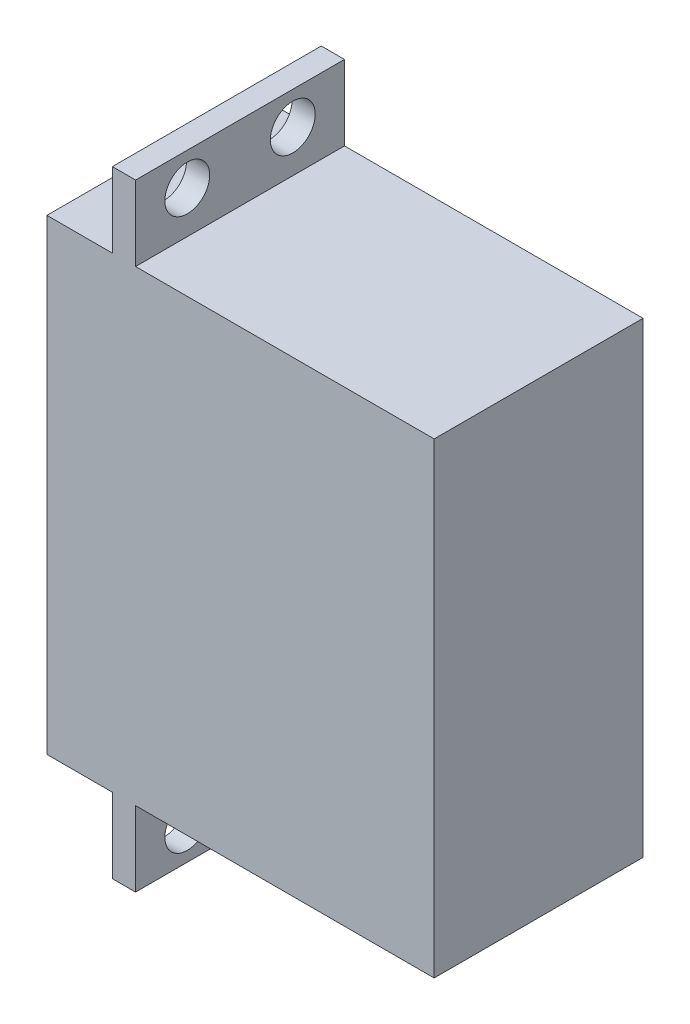
ISO-10303-21;
HEADER;
FILE_DESCRIPTION(('STEP AP214'),'2;1');
FILE_NAME('part.step','',(''),(''),'','','');
FILE_SCHEMA(('AUTOMOTIVE_DESIGN { 1 0 10303 214 1 1 1 1 }'));
ENDSEC;
DATA;
#1=APPLICATION_CONTEXT('core data for automotive mechanical design processes');
#2=APPLICATION_PROTOCOL_DEFINITION('international standard','automotive_design',2000,#1);
#3=PRODUCT_CONTEXT('',#1,'mechanical');
#4=PRODUCT('Part','Part','',(#3));
#5=PRODUCT_RELATED_PRODUCT_CATEGORY('part','',(#4));
#6=PRODUCT_DEFINITION_FORMATION('','',#4);
#7=PRODUCT_DEFINITION_CONTEXT('part definition',#1,'design');
#8=PRODUCT_DEFINITION('design','',#6,#7);
#9=PRODUCT_DEFINITION_SHAPE('','',#8);
#10=(LENGTH_UNIT() NAMED_UNIT(*) SI_UNIT(.MILLI.,.METRE.));
#11=(NAMED_UNIT(*) PLANE_ANGLE_UNIT() SI_UNIT($,.RADIAN.));
#12=(NAMED_UNIT(*) SI_UNIT($,.STERADIAN.) SOLID_ANGLE_UNIT());
#13=UNCERTAINTY_MEASURE_WITH_UNIT(LENGTH_MEASURE(1.E-05),#10,'distance_accuracy_value','');
#14=(GEOMETRIC_REPRESENTATION_CONTEXT(3) GLOBAL_UNCERTAINTY_ASSIGNED_CONTEXT((#13)) GLOBAL_UNIT_ASSIGNED_CONTEXT((#10,
#11,#12)) REPRESENTATION_CONTEXT('',''));
#15=CARTESIAN_POINT('',(0.,0.,0.));
#16=DIRECTION('',(0.,0.,1.));
#17=DIRECTION('',(1.,0.,0.));
#18=AXIS2_PLACEMENT_3D('',#15,#16,#17);
#19=CARTESIAN_POINT('',(59.0999999999965,-20.75,19.8));
#20=DIRECTION('',(0.,1.,0.));
#21=DIRECTION('',(-1.,0.,0.));
#22=AXIS2_PLACEMENT_3D('',#19,#20,#21);
#23=PLANE('',#22);
#24=DIRECTION('',(0.,0.,1.));
#25=VECTOR('',#24,1.);
#26=CARTESIAN_POINT('',(71.0999999999965,-20.75,19.8));
#27=LINE('',#26,#25);
#28=CARTESIAN_POINT('',(71.0999999999965,-20.75,0.));
#29=VERTEX_POINT('',#28);
#30=CARTESIAN_POINT('',(71.0999999999965,-20.75,19.8));
#31=VERTEX_POINT('',#30);
#32=EDGE_CURVE('E153',#29,#31,#27,.T.);
#33=ORIENTED_EDGE('',*,*,#32,.F.);
#34=DIRECTION('',(1.,0.,0.));
#35=VECTOR('',#34,1.);
#36=CARTESIAN_POINT('',(59.0999999999965,-20.75,0.));
#37=LINE('',#36,#35);
#38=CARTESIAN_POINT('',(99.3999999999966,-20.75,0.));
#39=VERTEX_POINT('',#38);
#40=EDGE_CURVE('E215',#29,#39,#37,.T.);
#41=ORIENTED_EDGE('',*,*,#40,.T.);
#42=DIRECTION('',(0.,0.,-1.));
#43=VECTOR('',#42,1.);
#44=CARTESIAN_POINT('',(99.3999999999966,-20.75,19.8));
#45=LINE('',#44,#43);
#46=CARTESIAN_POINT('',(99.3999999999966,-20.75,19.8));
#47=VERTEX_POINT('',#46);
#48=EDGE_CURVE('E11',#47,#39,#45,.T.);
#49=ORIENTED_EDGE('',*,*,#48,.F.);
#50=DIRECTION('',(1.,0.,0.));
#51=VECTOR('',#50,1.);
#52=CARTESIAN_POINT('',(59.0999999999965,-20.75,19.8));
#53=LINE('',#52,#51);
#54=EDGE_CURVE('E54',#31,#47,#53,.T.);
#55=ORIENTED_EDGE('',*,*,#54,.F.);
#56=EDGE_LOOP('',(#33,#41,#49,#55));
#57=FACE_BOUND('',#56,.T.);
#58=ADVANCED_FACE('F39',(#57),#23,.F.);
#59=DIRECTION('',(0.,0.,-1.));
#60=VECTOR('',#59,1.);
#61=CARTESIAN_POINT('',(68.8999999999966,-20.75,19.8));
#62=LINE('',#61,#60);
#63=CARTESIAN_POINT('',(68.8999999999966,-20.75,19.8));
#64=VERTEX_POINT('',#63);
#65=CARTESIAN_POINT('',(68.8999999999966,-20.75,0.));
#66=VERTEX_POINT('',#65);
#67=EDGE_CURVE('E62',#64,#66,#62,.T.);
#68=ORIENTED_EDGE('',*,*,#67,.F.);
#69=CARTESIAN_POINT('',(62.6999999999965,-20.75,19.8));
#70=VERTEX_POINT('',#69);
#71=EDGE_CURVE('E219',#70,#64,#53,.T.);
#72=ORIENTED_EDGE('',*,*,#71,.F.);
#73=DIRECTION('',(0.,0.,1.));
#74=VECTOR('',#73,1.);
#75=CARTESIAN_POINT('',(62.6999999999965,-20.75,0.));
#76=LINE('',#75,#74);
#77=CARTESIAN_POINT('',(62.6999999999965,-20.75,0.));
#78=VERTEX_POINT('',#77);
#79=EDGE_CURVE('E209',#78,#70,#76,.T.);
#80=ORIENTED_EDGE('',*,*,#79,.F.);
#81=EDGE_CURVE('E230',#78,#66,#37,.T.);
#82=ORIENTED_EDGE('',*,*,#81,.T.);
#83=EDGE_LOOP('',(#68,#72,#80,#82));
#84=FACE_BOUND('',#83,.T.);
#85=ADVANCED_FACE('F326',(#84),#23,.F.);
#86=CARTESIAN_POINT('',(59.0999999999965,23.5,19.8));
#87=DIRECTION('',(0.,1.,0.));
#88=DIRECTION('',(-1.,0.,0.));
#89=AXIS2_PLACEMENT_3D('',#86,#87,#88);
#90=PLANE('',#89);
#91=DIRECTION('',(0.,0.,-1.));
#92=VECTOR('',#91,1.);
#93=CARTESIAN_POINT('',(71.0999999999965,23.5,0.));
#94=LINE('',#93,#92);
#95=CARTESIAN_POINT('',(71.0999999999965,23.5,19.8));
#96=VERTEX_POINT('',#95);
#97=CARTESIAN_POINT('',(71.0999999999965,23.5,0.));
#98=VERTEX_POINT('',#97);
#99=EDGE_CURVE('E155',#96,#98,#94,.T.);
#100=ORIENTED_EDGE('',*,*,#99,.F.);
#101=DIRECTION('',(1.,0.,0.));
#102=VECTOR('',#101,1.);
#103=CARTESIAN_POINT('',(59.0999999999965,23.5,19.8));
#104=LINE('',#103,#102);
#105=CARTESIAN_POINT('',(99.3999999999966,23.5,19.8));
#106=VERTEX_POINT('',#105);
#107=EDGE_CURVE('E226',#96,#106,#104,.T.);
#108=ORIENTED_EDGE('',*,*,#107,.T.);
#109=DIRECTION('',(0.,0.,-1.));
#110=VECTOR('',#109,1.);
#111=CARTESIAN_POINT('',(99.3999999999966,23.5,19.8));
#112=LINE('',#111,#110);
#113=CARTESIAN_POINT('',(99.3999999999966,23.5,0.));
#114=VERTEX_POINT('',#113);
#115=EDGE_CURVE('E47',#106,#114,#112,.T.);
#116=ORIENTED_EDGE('',*,*,#115,.T.);
#117=DIRECTION('',(1.,0.,0.));
#118=VECTOR('',#117,1.);
#119=CARTESIAN_POINT('',(59.0999999999965,23.5,0.));
#120=LINE('',#119,#118);
#121=EDGE_CURVE('E237',#98,#114,#120,.T.);
#122=ORIENTED_EDGE('',*,*,#121,.F.);
#123=EDGE_LOOP('',(#100,#108,#116,#122));
#124=FACE_BOUND('',#123,.T.);
#125=ADVANCED_FACE('F246',(#124),#90,.T.);
#126=DIRECTION('',(0.,0.,1.));
#127=VECTOR('',#126,1.);
#128=CARTESIAN_POINT('',(68.8999999999966,23.5,0.));
#129=LINE('',#128,#127);
#130=CARTESIAN_POINT('',(68.8999999999966,23.5,0.));
#131=VERTEX_POINT('',#130);
#132=CARTESIAN_POINT('',(68.8999999999966,23.5,19.8));
#133=VERTEX_POINT('',#132);
#134=EDGE_CURVE('E160',#131,#133,#129,.T.);
#135=ORIENTED_EDGE('',*,*,#134,.F.);
#136=CARTESIAN_POINT('',(62.6999999999965,23.5,0.));
#137=VERTEX_POINT('',#136);
#138=EDGE_CURVE('E238',#137,#131,#120,.T.);
#139=ORIENTED_EDGE('',*,*,#138,.F.);
#140=DIRECTION('',(0.,0.,-1.));
#141=VECTOR('',#140,1.);
#142=CARTESIAN_POINT('',(62.6999999999965,23.5,0.));
#143=LINE('',#142,#141);
#144=CARTESIAN_POINT('',(62.6999999999965,23.5,19.8));
#145=VERTEX_POINT('',#144);
#146=EDGE_CURVE('E203',#145,#137,#143,.T.);
#147=ORIENTED_EDGE('',*,*,#146,.F.);
#148=EDGE_CURVE('E227',#145,#133,#104,.T.);
#149=ORIENTED_EDGE('',*,*,#148,.T.);
#150=EDGE_LOOP('',(#135,#139,#147,#149));
#151=FACE_BOUND('',#150,.T.);
#152=ADVANCED_FACE('F333',(#151),#90,.T.);
#153=CARTESIAN_POINT('',(0.,0.,19.8));
#154=DIRECTION('',(0.,0.,-1.));
#155=DIRECTION('',(-1.,0.,0.));
#156=AXIS2_PLACEMENT_3D('',#153,#154,#155);
#157=PLANE('',#156);
#158=DIRECTION('',(0.,1.,0.));
#159=VECTOR('',#158,1.);
#160=CARTESIAN_POINT('',(62.6999999999965,0.,19.8));
#161=LINE('',#160,#159);
#162=EDGE_CURVE('E212',#70,#145,#161,.T.);
#163=ORIENTED_EDGE('',*,*,#162,.F.);
#164=ORIENTED_EDGE('',*,*,#71,.T.);
#165=DIRECTION('',(0.,1.,0.));
#166=VECTOR('',#165,1.);
#167=CARTESIAN_POINT('',(68.8999999999966,-27.85,19.8));
#168=LINE('',#167,#166);
#169=CARTESIAN_POINT('',(68.8999999999966,-27.85,19.8));
#170=VERTEX_POINT('',#169);
#171=EDGE_CURVE('E136',#170,#64,#168,.T.);
#172=ORIENTED_EDGE('',*,*,#171,.F.);
#173=DIRECTION('',(-1.,0.,0.));
#174=VECTOR('',#173,1.);
#175=CARTESIAN_POINT('',(71.0999999999965,-27.85,19.8));
#176=LINE('',#175,#174);
#177=CARTESIAN_POINT('',(71.0999999999965,-27.85,19.8));
#178=VERTEX_POINT('',#177);
#179=EDGE_CURVE('E128',#178,#170,#176,.T.);
#180=ORIENTED_EDGE('',*,*,#179,.F.);
#181=DIRECTION('',(0.,1.,0.));
#182=VECTOR('',#181,1.);
#183=CARTESIAN_POINT('',(71.0999999999965,-27.85,19.8));
#184=LINE('',#183,#182);
#185=EDGE_CURVE('E133',#178,#31,#184,.T.);
#186=ORIENTED_EDGE('',*,*,#185,.T.);
#187=ORIENTED_EDGE('',*,*,#54,.T.);
#188=DIRECTION('',(0.,-1.,0.));
#189=VECTOR('',#188,1.);
#190=CARTESIAN_POINT('',(99.3999999999966,23.5,19.8));
#191=LINE('',#190,#189);
#192=EDGE_CURVE('E222',#106,#47,#191,.T.);
#193=ORIENTED_EDGE('',*,*,#192,.F.);
#194=ORIENTED_EDGE('',*,*,#107,.F.);
#195=DIRECTION('',(0.,-1.,0.));
#196=VECTOR('',#195,1.);
#197=CARTESIAN_POINT('',(71.0999999999965,30.6,19.8));
#198=LINE('',#197,#196);
#199=CARTESIAN_POINT('',(71.0999999999965,30.6,19.8));
#200=VERTEX_POINT('',#199);
#201=EDGE_CURVE('E178',#200,#96,#198,.T.);
#202=ORIENTED_EDGE('',*,*,#201,.F.);
#203=DIRECTION('',(1.,0.,0.));
#204=VECTOR('',#203,1.);
#205=CARTESIAN_POINT('',(71.0999999999965,30.6,19.8));
#206=LINE('',#205,#204);
#207=CARTESIAN_POINT('',(68.8999999999966,30.6,19.8));
#208=VERTEX_POINT('',#207);
#209=EDGE_CURVE('E176',#208,#200,#206,.T.);
#210=ORIENTED_EDGE('',*,*,#209,.F.);
#211=DIRECTION('',(0.,-1.,0.));
#212=VECTOR('',#211,1.);
#213=CARTESIAN_POINT('',(68.8999999999966,30.6,19.8));
#214=LINE('',#213,#212);
#215=EDGE_CURVE('E186',#208,#133,#214,.T.);
#216=ORIENTED_EDGE('',*,*,#215,.T.);
#217=ORIENTED_EDGE('',*,*,#148,.F.);
#218=EDGE_LOOP('',(#163,#164,#172,#180,#186,#187,#193,#194,#202,#210,#216,#217));
#219=FACE_BOUND('',#218,.T.);
#220=ADVANCED_FACE('F131',(#219),#157,.F.);
#221=CARTESIAN_POINT('',(0.,0.,0.));
#222=DIRECTION('',(0.,0.,-1.));
#223=DIRECTION('',(-1.,0.,0.));
#224=AXIS2_PLACEMENT_3D('',#221,#222,#223);
#225=PLANE('',#224);
#226=ORIENTED_EDGE('',*,*,#81,.F.);
#227=DIRECTION('',(0.,-1.,0.));
#228=VECTOR('',#227,1.);
#229=CARTESIAN_POINT('',(62.6999999999965,0.,0.));
#230=LINE('',#229,#228);
#231=EDGE_CURVE('E206',#137,#78,#230,.T.);
#232=ORIENTED_EDGE('',*,*,#231,.F.);
#233=ORIENTED_EDGE('',*,*,#138,.T.);
#234=DIRECTION('',(0.,-1.,0.));
#235=VECTOR('',#234,1.);
#236=CARTESIAN_POINT('',(68.8999999999966,30.6,0.));
#237=LINE('',#236,#235);
#238=CARTESIAN_POINT('',(68.8999999999966,30.6,0.));
#239=VERTEX_POINT('',#238);
#240=EDGE_CURVE('E190',#239,#131,#237,.T.);
#241=ORIENTED_EDGE('',*,*,#240,.F.);
#242=DIRECTION('',(-1.,0.,0.));
#243=VECTOR('',#242,1.);
#244=CARTESIAN_POINT('',(71.0999999999965,30.6,0.));
#245=LINE('',#244,#243);
#246=CARTESIAN_POINT('',(71.0999999999965,30.6,0.));
#247=VERTEX_POINT('',#246);
#248=EDGE_CURVE('E170',#247,#239,#245,.T.);
#249=ORIENTED_EDGE('',*,*,#248,.F.);
#250=DIRECTION('',(0.,-1.,0.));
#251=VECTOR('',#250,1.);
#252=CARTESIAN_POINT('',(71.0999999999965,30.6,0.));
#253=LINE('',#252,#251);
#254=EDGE_CURVE('E194',#247,#98,#253,.T.);
#255=ORIENTED_EDGE('',*,*,#254,.T.);
#256=ORIENTED_EDGE('',*,*,#121,.T.);
#257=DIRECTION('',(0.,-1.,0.));
#258=VECTOR('',#257,1.);
#259=CARTESIAN_POINT('',(99.3999999999966,23.5,0.));
#260=LINE('',#259,#258);
#261=EDGE_CURVE('E233',#114,#39,#260,.T.);
#262=ORIENTED_EDGE('',*,*,#261,.T.);
#263=ORIENTED_EDGE('',*,*,#40,.F.);
#264=DIRECTION('',(0.,1.,0.));
#265=VECTOR('',#264,1.);
#266=CARTESIAN_POINT('',(71.0999999999965,-27.85,0.));
#267=LINE('',#266,#265);
#268=CARTESIAN_POINT('',(71.0999999999965,-27.85,0.));
#269=VERTEX_POINT('',#268);
#270=EDGE_CURVE('E271',#269,#29,#267,.T.);
#271=ORIENTED_EDGE('',*,*,#270,.F.);
#272=DIRECTION('',(1.,0.,0.));
#273=VECTOR('',#272,1.);
#274=CARTESIAN_POINT('',(71.0999999999965,-27.85,0.));
#275=LINE('',#274,#273);
#276=CARTESIAN_POINT('',(68.8999999999966,-27.85,0.));
#277=VERTEX_POINT('',#276);
#278=EDGE_CURVE('E146',#277,#269,#275,.T.);
#279=ORIENTED_EDGE('',*,*,#278,.F.);
#280=DIRECTION('',(0.,1.,0.));
#281=VECTOR('',#280,1.);
#282=CARTESIAN_POINT('',(68.8999999999966,-27.85,0.));
#283=LINE('',#282,#281);
#284=EDGE_CURVE('E162',#277,#66,#283,.T.);
#285=ORIENTED_EDGE('',*,*,#284,.T.);
#286=EDGE_LOOP('',(#226,#232,#233,#241,#249,#255,#256,#262,#263,#271,#279,#285));
#287=FACE_BOUND('',#286,.T.);
#288=ADVANCED_FACE('F254',(#287),#225,.T.);
#289=CARTESIAN_POINT('',(99.3999999999966,23.5,19.8));
#290=DIRECTION('',(1.,0.,0.));
#291=DIRECTION('',(0.,0.,-1.));
#292=AXIS2_PLACEMENT_3D('',#289,#290,#291);
#293=PLANE('',#292);
#294=ORIENTED_EDGE('',*,*,#261,.F.);
#295=ORIENTED_EDGE('',*,*,#115,.F.);
#296=ORIENTED_EDGE('',*,*,#192,.T.);
#297=ORIENTED_EDGE('',*,*,#48,.T.);
#298=EDGE_LOOP('',(#294,#295,#296,#297));
#299=FACE_BOUND('',#298,.T.);
#300=ADVANCED_FACE('F250',(#299),#293,.T.);
#301=CARTESIAN_POINT('',(62.6999999999965,12.5,9.9));
#302=DIRECTION('',(-1.,0.,0.));
#303=DIRECTION('',(0.,0.,1.));
#304=AXIS2_PLACEMENT_3D('',#301,#302,#303);
#305=CYLINDRICAL_SURFACE('',#304,2.9);
#306=CARTESIAN_POINT('',(62.6999999999965,12.5,9.9));
#307=DIRECTION('',(-1.,0.,0.));
#308=DIRECTION('',(0.,0.,1.));
#309=AXIS2_PLACEMENT_3D('',#306,#307,#308);
#310=CIRCLE('',#309,2.9);
#311=CARTESIAN_POINT('',(62.6999999999965,12.5,12.8));
#312=VERTEX_POINT('',#311);
#313=EDGE_CURVE('E199',#312,#312,#310,.T.);
#314=ORIENTED_EDGE('',*,*,#313,.T.);
#315=EDGE_LOOP('',(#314));
#316=FACE_BOUND('',#315,.T.);
#317=CARTESIAN_POINT('',(59.0999999999965,12.5,9.9));
#318=DIRECTION('',(-1.,0.,0.));
#319=DIRECTION('',(0.,0.,1.));
#320=AXIS2_PLACEMENT_3D('',#317,#318,#319);
#321=CIRCLE('',#320,2.9);
#322=CARTESIAN_POINT('',(59.0999999999965,12.5,12.8));
#323=VERTEX_POINT('',#322);
#324=EDGE_CURVE('E198',#323,#323,#321,.T.);
#325=ORIENTED_EDGE('',*,*,#324,.F.);
#326=EDGE_LOOP('',(#325));
#327=FACE_BOUND('',#326,.T.);
#328=ADVANCED_FACE('F343',(#316,#327),#305,.T.);
#329=CARTESIAN_POINT('',(62.6999999999965,0.,0.));
#330=DIRECTION('',(-1.,0.,0.));
#331=DIRECTION('',(0.,0.,1.));
#332=AXIS2_PLACEMENT_3D('',#329,#330,#331);
#333=PLANE('',#332);
#334=ORIENTED_EDGE('',*,*,#313,.F.);
#335=EDGE_LOOP('',(#334));
#336=FACE_BOUND('',#335,.T.);
#337=ORIENTED_EDGE('',*,*,#146,.T.);
#338=ORIENTED_EDGE('',*,*,#231,.T.);
#339=ORIENTED_EDGE('',*,*,#79,.T.);
#340=ORIENTED_EDGE('',*,*,#162,.T.);
#341=EDGE_LOOP('',(#337,#338,#339,#340));
#342=FACE_BOUND('',#341,.T.);
#343=ADVANCED_FACE('F348',(#336,#342),#333,.T.);
#344=CARTESIAN_POINT('',(59.0999999999965,23.5,19.8));
#345=DIRECTION('',(1.,0.,0.));
#346=DIRECTION('',(0.,0.,-1.));
#347=AXIS2_PLACEMENT_3D('',#344,#345,#346);
#348=PLANE('',#347);
#349=ORIENTED_EDGE('',*,*,#324,.T.);
#350=EDGE_LOOP('',(#349));
#351=FACE_BOUND('',#350,.T.);
#352=ADVANCED_FACE('F340',(#351),#348,.F.);
#353=CARTESIAN_POINT('',(71.0999999999965,30.6,0.));
#354=DIRECTION('',(-1.,0.,0.));
#355=DIRECTION('',(0.,-1.,0.));
#356=AXIS2_PLACEMENT_3D('',#353,#354,#355);
#357=PLANE('',#356);
#358=CARTESIAN_POINT('',(71.0999999999965,27.5,4.8999999999999));
#359=DIRECTION('',(-1.,0.,0.));
#360=DIRECTION('',(0.,-1.,0.));
#361=AXIS2_PLACEMENT_3D('',#358,#359,#360);
#362=CIRCLE('',#361,2.125);
#363=CARTESIAN_POINT('',(71.0999999999965,25.375,4.8999999999999));
#364=VERTEX_POINT('',#363);
#365=EDGE_CURVE('E260',#364,#364,#362,.T.);
#366=ORIENTED_EDGE('',*,*,#365,.T.);
#367=EDGE_LOOP('',(#366));
#368=FACE_BOUND('',#367,.T.);
#369=CARTESIAN_POINT('',(71.0999999999965,27.5,14.9));
#370=DIRECTION('',(-1.,0.,0.));
#371=DIRECTION('',(0.,-1.,0.));
#372=AXIS2_PLACEMENT_3D('',#369,#370,#371);
#373=CIRCLE('',#372,2.125);
#374=CARTESIAN_POINT('',(71.0999999999965,25.375,14.9));
#375=VERTEX_POINT('',#374);
#376=EDGE_CURVE('E266',#375,#375,#373,.T.);
#377=ORIENTED_EDGE('',*,*,#376,.T.);
#378=EDGE_LOOP('',(#377));
#379=FACE_BOUND('',#378,.T.);
#380=ORIENTED_EDGE('',*,*,#99,.T.);
#381=ORIENTED_EDGE('',*,*,#254,.F.);
#382=DIRECTION('',(0.,0.,-1.));
#383=VECTOR('',#382,1.);
#384=CARTESIAN_POINT('',(71.0999999999965,30.6,0.));
#385=LINE('',#384,#383);
#386=EDGE_CURVE('E166',#200,#247,#385,.T.);
#387=ORIENTED_EDGE('',*,*,#386,.F.);
#388=ORIENTED_EDGE('',*,*,#201,.T.);
#389=EDGE_LOOP('',(#380,#381,#387,#388));
#390=FACE_BOUND('',#389,.T.);
#391=ADVANCED_FACE('F359',(#368,#379,#390),#357,.F.);
#392=CARTESIAN_POINT('',(68.8999999999966,30.6,0.));
#393=DIRECTION('',(1.,0.,0.));
#394=DIRECTION('',(0.,1.,0.));
#395=AXIS2_PLACEMENT_3D('',#392,#393,#394);
#396=PLANE('',#395);
#397=CARTESIAN_POINT('',(68.8999999999966,27.5,4.8999999999999));
#398=DIRECTION('',(-1.,0.,0.));
#399=DIRECTION('',(0.,1.,0.));
#400=AXIS2_PLACEMENT_3D('',#397,#398,#399);
#401=CIRCLE('',#400,2.125);
#402=CARTESIAN_POINT('',(68.8999999999966,29.625,4.8999999999999));
#403=VERTEX_POINT('',#402);
#404=EDGE_CURVE('E297',#403,#403,#401,.T.);
#405=ORIENTED_EDGE('',*,*,#404,.F.);
#406=EDGE_LOOP('',(#405));
#407=FACE_BOUND('',#406,.T.);
#408=CARTESIAN_POINT('',(68.8999999999966,27.5,14.9));
#409=DIRECTION('',(-1.,0.,0.));
#410=DIRECTION('',(0.,-1.,0.));
#411=AXIS2_PLACEMENT_3D('',#408,#409,#410);
#412=CIRCLE('',#411,2.125);
#413=CARTESIAN_POINT('',(68.8999999999966,25.375,14.9));
#414=VERTEX_POINT('',#413);
#415=EDGE_CURVE('E293',#414,#414,#412,.T.);
#416=ORIENTED_EDGE('',*,*,#415,.F.);
#417=EDGE_LOOP('',(#416));
#418=FACE_BOUND('',#417,.T.);
#419=ORIENTED_EDGE('',*,*,#134,.T.);
#420=ORIENTED_EDGE('',*,*,#215,.F.);
#421=DIRECTION('',(0.,0.,1.));
#422=VECTOR('',#421,1.);
#423=CARTESIAN_POINT('',(68.8999999999966,30.6,0.));
#424=LINE('',#423,#422);
#425=EDGE_CURVE('E173',#239,#208,#424,.T.);
#426=ORIENTED_EDGE('',*,*,#425,.F.);
#427=ORIENTED_EDGE('',*,*,#240,.T.);
#428=EDGE_LOOP('',(#419,#420,#426,#427));
#429=FACE_BOUND('',#428,.T.);
#430=ADVANCED_FACE('F362',(#407,#418,#429),#396,.F.);
#431=CARTESIAN_POINT('',(0.,30.5999999999999,0.));
#432=DIRECTION('',(0.,-1.,0.));
#433=DIRECTION('',(1.,0.,0.));
#434=AXIS2_PLACEMENT_3D('',#431,#432,#433);
#435=PLANE('',#434);
#436=ORIENTED_EDGE('',*,*,#386,.T.);
#437=ORIENTED_EDGE('',*,*,#248,.T.);
#438=ORIENTED_EDGE('',*,*,#425,.T.);
#439=ORIENTED_EDGE('',*,*,#209,.T.);
#440=EDGE_LOOP('',(#436,#437,#438,#439));
#441=FACE_BOUND('',#440,.T.);
#442=ADVANCED_FACE('F321',(#441),#435,.F.);
#443=CARTESIAN_POINT('',(71.0999999999965,-27.85,19.8));
#444=DIRECTION('',(-1.,0.,0.));
#445=DIRECTION('',(0.,-1.,0.));
#446=AXIS2_PLACEMENT_3D('',#443,#444,#445);
#447=PLANE('',#446);
#448=CARTESIAN_POINT('',(71.0999999999965,-24.75,14.9));
#449=DIRECTION('',(-1.,0.,0.));
#450=DIRECTION('',(0.,-1.,0.));
#451=AXIS2_PLACEMENT_3D('',#448,#449,#450);
#452=CIRCLE('',#451,2.125);
#453=CARTESIAN_POINT('',(71.0999999999965,-26.875,14.9));
#454=VERTEX_POINT('',#453);
#455=EDGE_CURVE('E285',#454,#454,#452,.T.);
#456=ORIENTED_EDGE('',*,*,#455,.T.);
#457=EDGE_LOOP('',(#456));
#458=FACE_BOUND('',#457,.T.);
#459=CARTESIAN_POINT('',(71.0999999999965,-24.75,4.8999999999999));
#460=DIRECTION('',(-1.,0.,0.));
#461=DIRECTION('',(0.,-1.,0.));
#462=AXIS2_PLACEMENT_3D('',#459,#460,#461);
#463=CIRCLE('',#462,2.125);
#464=CARTESIAN_POINT('',(71.0999999999965,-26.875,4.8999999999999));
#465=VERTEX_POINT('',#464);
#466=EDGE_CURVE('E289',#465,#465,#463,.T.);
#467=ORIENTED_EDGE('',*,*,#466,.T.);
#468=EDGE_LOOP('',(#467));
#469=FACE_BOUND('',#468,.T.);
#470=ORIENTED_EDGE('',*,*,#32,.T.);
#471=ORIENTED_EDGE('',*,*,#185,.F.);
#472=DIRECTION('',(0.,0.,1.));
#473=VECTOR('',#472,1.);
#474=CARTESIAN_POINT('',(71.0999999999965,-27.85,19.8));
#475=LINE('',#474,#473);
#476=EDGE_CURVE('E141',#269,#178,#475,.T.);
#477=ORIENTED_EDGE('',*,*,#476,.F.);
#478=ORIENTED_EDGE('',*,*,#270,.T.);
#479=EDGE_LOOP('',(#470,#471,#477,#478));
#480=FACE_BOUND('',#479,.T.);
#481=ADVANCED_FACE('F152',(#458,#469,#480),#447,.F.);
#482=CARTESIAN_POINT('',(68.8999999999966,-27.85,19.8));
#483=DIRECTION('',(1.,0.,0.));
#484=DIRECTION('',(0.,1.,0.));
#485=AXIS2_PLACEMENT_3D('',#482,#483,#484);
#486=PLANE('',#485);
#487=CARTESIAN_POINT('',(68.8999999999966,-24.75,14.9));
#488=DIRECTION('',(-1.,0.,0.));
#489=DIRECTION('',(0.,1.,0.));
#490=AXIS2_PLACEMENT_3D('',#487,#488,#489);
#491=CIRCLE('',#490,2.125);
#492=CARTESIAN_POINT('',(68.8999999999966,-22.625,14.9));
#493=VERTEX_POINT('',#492);
#494=EDGE_CURVE('E298',#493,#493,#491,.T.);
#495=ORIENTED_EDGE('',*,*,#494,.F.);
#496=EDGE_LOOP('',(#495));
#497=FACE_BOUND('',#496,.T.);
#498=CARTESIAN_POINT('',(68.8999999999966,-24.75,4.8999999999999));
#499=DIRECTION('',(-1.,0.,0.));
#500=DIRECTION('',(0.,-1.,0.));
#501=AXIS2_PLACEMENT_3D('',#498,#499,#500);
#502=CIRCLE('',#501,2.125);
#503=CARTESIAN_POINT('',(68.8999999999966,-26.875,4.8999999999999));
#504=VERTEX_POINT('',#503);
#505=EDGE_CURVE('E302',#504,#504,#502,.T.);
#506=ORIENTED_EDGE('',*,*,#505,.F.);
#507=EDGE_LOOP('',(#506));
#508=FACE_BOUND('',#507,.T.);
#509=ORIENTED_EDGE('',*,*,#67,.T.);
#510=ORIENTED_EDGE('',*,*,#284,.F.);
#511=DIRECTION('',(0.,0.,-1.));
#512=VECTOR('',#511,1.);
#513=CARTESIAN_POINT('',(68.8999999999966,-27.85,19.8));
#514=LINE('',#513,#512);
#515=EDGE_CURVE('E140',#170,#277,#514,.T.);
#516=ORIENTED_EDGE('',*,*,#515,.F.);
#517=ORIENTED_EDGE('',*,*,#171,.T.);
#518=EDGE_LOOP('',(#509,#510,#516,#517));
#519=FACE_BOUND('',#518,.T.);
#520=ADVANCED_FACE('F278',(#497,#508,#519),#486,.F.);
#521=CARTESIAN_POINT('',(0.,-27.85,0.));
#522=DIRECTION('',(0.,1.,0.));
#523=DIRECTION('',(0.,0.,1.));
#524=AXIS2_PLACEMENT_3D('',#521,#522,#523);
#525=PLANE('',#524);
#526=ORIENTED_EDGE('',*,*,#476,.T.);
#527=ORIENTED_EDGE('',*,*,#179,.T.);
#528=ORIENTED_EDGE('',*,*,#515,.T.);
#529=ORIENTED_EDGE('',*,*,#278,.T.);
#530=EDGE_LOOP('',(#526,#527,#528,#529));
#531=FACE_BOUND('',#530,.T.);
#532=ADVANCED_FACE('F144',(#531),#525,.F.);
#533=CARTESIAN_POINT('',(75.9999999999965,-24.75,4.8999999999999));
#534=DIRECTION('',(-1.,0.,0.));
#535=DIRECTION('',(0.,-1.,0.));
#536=AXIS2_PLACEMENT_3D('',#533,#534,#535);
#537=CYLINDRICAL_SURFACE('',#536,2.125);
#538=ORIENTED_EDGE('',*,*,#505,.T.);
#539=EDGE_LOOP('',(#538));
#540=FACE_BOUND('',#539,.T.);
#541=ORIENTED_EDGE('',*,*,#466,.F.);
#542=EDGE_LOOP('',(#541));
#543=FACE_BOUND('',#542,.T.);
#544=ADVANCED_FACE('F310',(#540,#543),#537,.F.);
#545=CARTESIAN_POINT('',(75.9999999999965,-24.75,14.9));
#546=DIRECTION('',(-1.,0.,0.));
#547=DIRECTION('',(0.,-1.,0.));
#548=AXIS2_PLACEMENT_3D('',#545,#546,#547);
#549=CYLINDRICAL_SURFACE('',#548,2.125);
#550=ORIENTED_EDGE('',*,*,#494,.T.);
#551=EDGE_LOOP('',(#550));
#552=FACE_BOUND('',#551,.T.);
#553=ORIENTED_EDGE('',*,*,#455,.F.);
#554=EDGE_LOOP('',(#553));
#555=FACE_BOUND('',#554,.T.);
#556=ADVANCED_FACE('F410',(#552,#555),#549,.F.);
#557=CARTESIAN_POINT('',(75.9999999999965,27.5,14.9));
#558=DIRECTION('',(-1.,0.,0.));
#559=DIRECTION('',(0.,-1.,0.));
#560=AXIS2_PLACEMENT_3D('',#557,#558,#559);
#561=CYLINDRICAL_SURFACE('',#560,2.125);
#562=ORIENTED_EDGE('',*,*,#415,.T.);
#563=EDGE_LOOP('',(#562));
#564=FACE_BOUND('',#563,.T.);
#565=ORIENTED_EDGE('',*,*,#376,.F.);
#566=EDGE_LOOP('',(#565));
#567=FACE_BOUND('',#566,.T.);
#568=ADVANCED_FACE('F419',(#564,#567),#561,.F.);
#569=CARTESIAN_POINT('',(75.9999999999965,27.5,4.8999999999999));
#570=DIRECTION('',(-1.,0.,0.));
#571=DIRECTION('',(0.,-1.,0.));
#572=AXIS2_PLACEMENT_3D('',#569,#570,#571);
#573=CYLINDRICAL_SURFACE('',#572,2.125);
#574=ORIENTED_EDGE('',*,*,#404,.T.);
#575=EDGE_LOOP('',(#574));
#576=FACE_BOUND('',#575,.T.);
#577=ORIENTED_EDGE('',*,*,#365,.F.);
#578=EDGE_LOOP('',(#577));
#579=FACE_BOUND('',#578,.T.);
#580=ADVANCED_FACE('F429',(#576,#579),#573,.F.);
#581=CLOSED_SHELL('',(#58,#85,#125,#152,#220,#288,#300,#328,#343,#352,#391,#430,#442,#481,#520,
#532,#544,#556,#568,#580));
#582=MANIFOLD_SOLID_BREP('B2',#581);
#583=ADVANCED_BREP_SHAPE_REPRESENTATION('',(#18,#582),#14);
#584=SHAPE_DEFINITION_REPRESENTATION(#9,#583);
ENDSEC;
END-ISO-10303-21;
